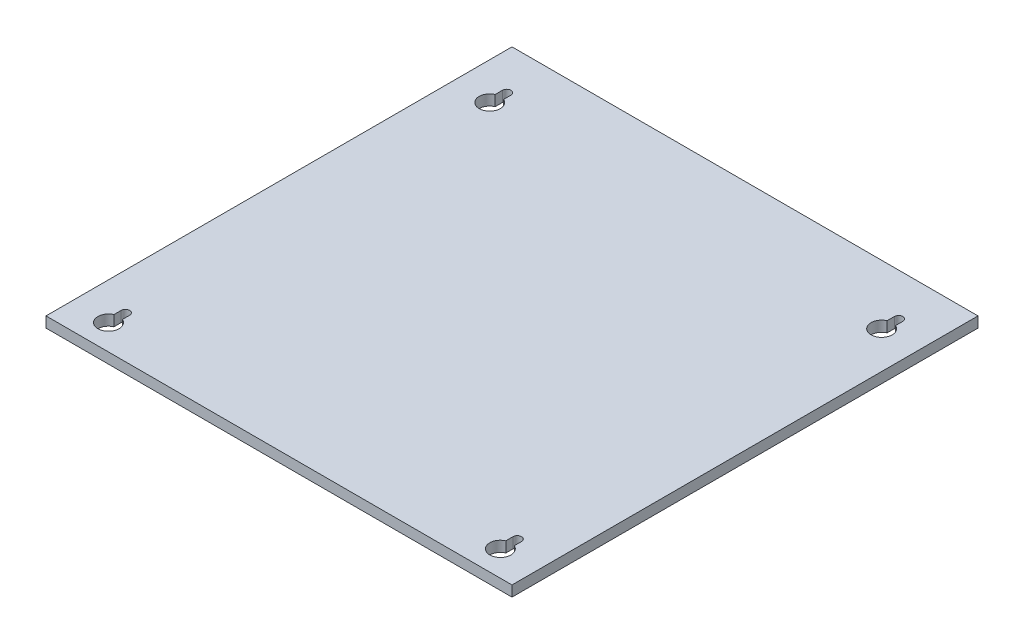
ISO-10303-21;
HEADER;
FILE_DESCRIPTION(('STEP AP214'),'2;1');
FILE_NAME('part.step','',(''),(''),'','','');
FILE_SCHEMA(('AUTOMOTIVE_DESIGN { 1 0 10303 214 1 1 1 1 }'));
ENDSEC;
DATA;
#1=APPLICATION_CONTEXT('core data for automotive mechanical design processes');
#2=APPLICATION_PROTOCOL_DEFINITION('international standard','automotive_design',2000,#1);
#3=PRODUCT_CONTEXT('',#1,'mechanical');
#4=PRODUCT('Part','Part','',(#3));
#5=PRODUCT_RELATED_PRODUCT_CATEGORY('part','',(#4));
#6=PRODUCT_DEFINITION_FORMATION('','',#4);
#7=PRODUCT_DEFINITION_CONTEXT('part definition',#1,'design');
#8=PRODUCT_DEFINITION('design','',#6,#7);
#9=PRODUCT_DEFINITION_SHAPE('','',#8);
#10=(LENGTH_UNIT() NAMED_UNIT(*) SI_UNIT(.MILLI.,.METRE.));
#11=(NAMED_UNIT(*) PLANE_ANGLE_UNIT() SI_UNIT($,.RADIAN.));
#12=(NAMED_UNIT(*) SI_UNIT($,.STERADIAN.) SOLID_ANGLE_UNIT());
#13=UNCERTAINTY_MEASURE_WITH_UNIT(LENGTH_MEASURE(1.E-05),#10,'distance_accuracy_value','');
#14=(GEOMETRIC_REPRESENTATION_CONTEXT(3) GLOBAL_UNCERTAINTY_ASSIGNED_CONTEXT((#13)) GLOBAL_UNIT_ASSIGNED_CONTEXT((#10,
#11,#12)) REPRESENTATION_CONTEXT('',''));
#15=CARTESIAN_POINT('',(0.,0.,0.));
#16=DIRECTION('',(0.,0.,1.));
#17=DIRECTION('',(1.,0.,0.));
#18=AXIS2_PLACEMENT_3D('',#15,#16,#17);
#19=CARTESIAN_POINT('',(114.935,0.,114.3));
#20=DIRECTION('',(-1.,0.,0.));
#21=DIRECTION('',(0.,0.,1.));
#22=AXIS2_PLACEMENT_3D('',#19,#20,#21);
#23=PLANE('',#22);
#24=DIRECTION('',(0.,0.,1.));
#25=VECTOR('',#24,1.);
#26=CARTESIAN_POINT('',(114.935,6.35,114.3));
#27=LINE('',#26,#25);
#28=CARTESIAN_POINT('',(114.935,6.35,114.3));
#29=VERTEX_POINT('',#28);
#30=CARTESIAN_POINT('',(114.935,6.35,118.640128867406));
#31=VERTEX_POINT('',#30);
#32=EDGE_CURVE('E314',#29,#31,#27,.T.);
#33=ORIENTED_EDGE('',*,*,#32,.T.);
#34=DIRECTION('',(0.,1.,0.));
#35=VECTOR('',#34,1.);
#36=CARTESIAN_POINT('',(114.935,0.,118.640128867406));
#37=LINE('',#36,#35);
#38=CARTESIAN_POINT('',(114.935,0.,118.640128867406));
#39=VERTEX_POINT('',#38);
#40=EDGE_CURVE('E11',#39,#31,#37,.T.);
#41=ORIENTED_EDGE('',*,*,#40,.F.);
#42=DIRECTION('',(0.,0.,1.));
#43=VECTOR('',#42,1.);
#44=CARTESIAN_POINT('',(114.935,0.,114.3));
#45=LINE('',#44,#43);
#46=CARTESIAN_POINT('',(114.935,0.,114.3));
#47=VERTEX_POINT('',#46);
#48=EDGE_CURVE('E318',#47,#39,#45,.T.);
#49=ORIENTED_EDGE('',*,*,#48,.F.);
#50=DIRECTION('',(0.,1.,0.));
#51=VECTOR('',#50,1.);
#52=CARTESIAN_POINT('',(114.935,0.,114.3));
#53=LINE('',#52,#51);
#54=EDGE_CURVE('E323',#47,#29,#53,.T.);
#55=ORIENTED_EDGE('',*,*,#54,.T.);
#56=EDGE_LOOP('',(#33,#41,#49,#55));
#57=FACE_BOUND('',#56,.T.);
#58=ADVANCED_FACE('F33',(#57),#23,.F.);
#59=CARTESIAN_POINT('',(117.475,0.,124.46));
#60=DIRECTION('',(0.,1.,0.));
#61=DIRECTION('',(0.,0.,1.));
#62=AXIS2_PLACEMENT_3D('',#59,#60,#61);
#63=CYLINDRICAL_SURFACE('',#62,6.35);
#64=CARTESIAN_POINT('',(117.475,6.35,124.46));
#65=DIRECTION('',(0.,1.,0.));
#66=DIRECTION('',(0.,0.,1.));
#67=AXIS2_PLACEMENT_3D('',#64,#65,#66);
#68=CIRCLE('',#67,6.35);
#69=CARTESIAN_POINT('',(120.015,6.35,118.640128867406));
#70=VERTEX_POINT('',#69);
#71=EDGE_CURVE('E311',#31,#70,#68,.T.);
#72=ORIENTED_EDGE('',*,*,#71,.T.);
#73=DIRECTION('',(0.,1.,0.));
#74=VECTOR('',#73,1.);
#75=CARTESIAN_POINT('',(120.015,0.,118.640128867406));
#76=LINE('',#75,#74);
#77=CARTESIAN_POINT('',(120.015,0.,118.640128867406));
#78=VERTEX_POINT('',#77);
#79=EDGE_CURVE('E40',#78,#70,#76,.T.);
#80=ORIENTED_EDGE('',*,*,#79,.F.);
#81=CARTESIAN_POINT('',(117.475,0.,124.46));
#82=DIRECTION('',(0.,1.,0.));
#83=DIRECTION('',(0.,0.,1.));
#84=AXIS2_PLACEMENT_3D('',#81,#82,#83);
#85=CIRCLE('',#84,6.35);
#86=EDGE_CURVE('E54',#39,#78,#85,.T.);
#87=ORIENTED_EDGE('',*,*,#86,.F.);
#88=ORIENTED_EDGE('',*,*,#40,.T.);
#89=EDGE_LOOP('',(#72,#80,#87,#88));
#90=FACE_BOUND('',#89,.T.);
#91=ADVANCED_FACE('F333',(#90),#63,.F.);
#92=CARTESIAN_POINT('',(120.015,0.,114.3));
#93=DIRECTION('',(1.,0.,0.));
#94=DIRECTION('',(0.,0.,-1.));
#95=AXIS2_PLACEMENT_3D('',#92,#93,#94);
#96=PLANE('',#95);
#97=DIRECTION('',(0.,0.,-1.));
#98=VECTOR('',#97,1.);
#99=CARTESIAN_POINT('',(120.015,6.35,114.3));
#100=LINE('',#99,#98);
#101=CARTESIAN_POINT('',(120.015,6.35,114.3));
#102=VERTEX_POINT('',#101);
#103=EDGE_CURVE('E308',#70,#102,#100,.T.);
#104=ORIENTED_EDGE('',*,*,#103,.T.);
#105=DIRECTION('',(0.,1.,0.));
#106=VECTOR('',#105,1.);
#107=CARTESIAN_POINT('',(120.015,0.,114.3));
#108=LINE('',#107,#106);
#109=CARTESIAN_POINT('',(120.015,0.,114.3));
#110=VERTEX_POINT('',#109);
#111=EDGE_CURVE('E326',#110,#102,#108,.T.);
#112=ORIENTED_EDGE('',*,*,#111,.F.);
#113=DIRECTION('',(0.,0.,-1.));
#114=VECTOR('',#113,1.);
#115=CARTESIAN_POINT('',(120.015,0.,114.3));
#116=LINE('',#115,#114);
#117=EDGE_CURVE('E321',#78,#110,#116,.T.);
#118=ORIENTED_EDGE('',*,*,#117,.F.);
#119=ORIENTED_EDGE('',*,*,#79,.T.);
#120=EDGE_LOOP('',(#104,#112,#118,#119));
#121=FACE_BOUND('',#120,.T.);
#122=ADVANCED_FACE('F330',(#121),#96,.F.);
#123=CARTESIAN_POINT('',(117.475,0.,114.3));
#124=DIRECTION('',(0.,1.,0.));
#125=DIRECTION('',(0.,0.,1.));
#126=AXIS2_PLACEMENT_3D('',#123,#124,#125);
#127=CYLINDRICAL_SURFACE('',#126,2.53999999999999);
#128=CARTESIAN_POINT('',(117.475,6.35,114.3));
#129=DIRECTION('',(0.,1.,0.));
#130=DIRECTION('',(0.,0.,1.));
#131=AXIS2_PLACEMENT_3D('',#128,#129,#130);
#132=CIRCLE('',#131,2.53999999999999);
#133=EDGE_CURVE('E306',#102,#29,#132,.T.);
#134=ORIENTED_EDGE('',*,*,#133,.T.);
#135=ORIENTED_EDGE('',*,*,#54,.F.);
#136=CARTESIAN_POINT('',(117.475,0.,114.3));
#137=DIRECTION('',(0.,1.,0.));
#138=DIRECTION('',(0.,0.,1.));
#139=AXIS2_PLACEMENT_3D('',#136,#137,#138);
#140=CIRCLE('',#139,2.53999999999999);
#141=EDGE_CURVE('E47',#110,#47,#140,.T.);
#142=ORIENTED_EDGE('',*,*,#141,.F.);
#143=ORIENTED_EDGE('',*,*,#111,.T.);
#144=EDGE_LOOP('',(#134,#135,#142,#143));
#145=FACE_BOUND('',#144,.T.);
#146=ADVANCED_FACE('F339',(#145),#127,.F.);
#147=CARTESIAN_POINT('',(-120.015,0.,114.3));
#148=DIRECTION('',(-1.,0.,0.));
#149=DIRECTION('',(0.,0.,1.));
#150=AXIS2_PLACEMENT_3D('',#147,#148,#149);
#151=PLANE('',#150);
#152=DIRECTION('',(0.,0.,1.));
#153=VECTOR('',#152,1.);
#154=CARTESIAN_POINT('',(-120.015,6.35,114.3));
#155=LINE('',#154,#153);
#156=CARTESIAN_POINT('',(-120.015,6.35,114.3));
#157=VERTEX_POINT('',#156);
#158=CARTESIAN_POINT('',(-120.015,6.35,118.640128867406));
#159=VERTEX_POINT('',#158);
#160=EDGE_CURVE('E282',#157,#159,#155,.T.);
#161=ORIENTED_EDGE('',*,*,#160,.T.);
#162=DIRECTION('',(0.,1.,0.));
#163=VECTOR('',#162,1.);
#164=CARTESIAN_POINT('',(-120.015,0.,118.640128867406));
#165=LINE('',#164,#163);
#166=CARTESIAN_POINT('',(-120.015,0.,118.640128867406));
#167=VERTEX_POINT('',#166);
#168=EDGE_CURVE('E303',#167,#159,#165,.T.);
#169=ORIENTED_EDGE('',*,*,#168,.F.);
#170=DIRECTION('',(0.,0.,1.));
#171=VECTOR('',#170,1.);
#172=CARTESIAN_POINT('',(-120.015,0.,114.3));
#173=LINE('',#172,#171);
#174=CARTESIAN_POINT('',(-120.015,0.,114.3));
#175=VERTEX_POINT('',#174);
#176=EDGE_CURVE('E287',#175,#167,#173,.T.);
#177=ORIENTED_EDGE('',*,*,#176,.F.);
#178=DIRECTION('',(0.,1.,0.));
#179=VECTOR('',#178,1.);
#180=CARTESIAN_POINT('',(-120.015,0.,114.3));
#181=LINE('',#180,#179);
#182=EDGE_CURVE('E294',#175,#157,#181,.T.);
#183=ORIENTED_EDGE('',*,*,#182,.T.);
#184=EDGE_LOOP('',(#161,#169,#177,#183));
#185=FACE_BOUND('',#184,.T.);
#186=ADVANCED_FACE('F341',(#185),#151,.F.);
#187=CARTESIAN_POINT('',(-117.475,0.,124.46));
#188=DIRECTION('',(0.,1.,0.));
#189=DIRECTION('',(0.,0.,1.));
#190=AXIS2_PLACEMENT_3D('',#187,#188,#189);
#191=CYLINDRICAL_SURFACE('',#190,6.35);
#192=CARTESIAN_POINT('',(-117.475,6.35,124.46));
#193=DIRECTION('',(0.,1.,0.));
#194=DIRECTION('',(0.,0.,1.));
#195=AXIS2_PLACEMENT_3D('',#192,#193,#194);
#196=CIRCLE('',#195,6.35);
#197=CARTESIAN_POINT('',(-114.935,6.35,118.640128867406));
#198=VERTEX_POINT('',#197);
#199=EDGE_CURVE('E279',#159,#198,#196,.T.);
#200=ORIENTED_EDGE('',*,*,#199,.T.);
#201=DIRECTION('',(0.,1.,0.));
#202=VECTOR('',#201,1.);
#203=CARTESIAN_POINT('',(-114.935,0.,118.640128867406));
#204=LINE('',#203,#202);
#205=CARTESIAN_POINT('',(-114.935,0.,118.640128867406));
#206=VERTEX_POINT('',#205);
#207=EDGE_CURVE('E300',#206,#198,#204,.T.);
#208=ORIENTED_EDGE('',*,*,#207,.F.);
#209=CARTESIAN_POINT('',(-117.475,0.,124.46));
#210=DIRECTION('',(0.,1.,0.));
#211=DIRECTION('',(0.,0.,1.));
#212=AXIS2_PLACEMENT_3D('',#209,#210,#211);
#213=CIRCLE('',#212,6.35);
#214=EDGE_CURVE('E289',#167,#206,#213,.T.);
#215=ORIENTED_EDGE('',*,*,#214,.F.);
#216=ORIENTED_EDGE('',*,*,#168,.T.);
#217=EDGE_LOOP('',(#200,#208,#215,#216));
#218=FACE_BOUND('',#217,.T.);
#219=ADVANCED_FACE('F347',(#218),#191,.F.);
#220=CARTESIAN_POINT('',(-114.935,0.,114.3));
#221=DIRECTION('',(1.,0.,0.));
#222=DIRECTION('',(0.,0.,-1.));
#223=AXIS2_PLACEMENT_3D('',#220,#221,#222);
#224=PLANE('',#223);
#225=DIRECTION('',(0.,0.,-1.));
#226=VECTOR('',#225,1.);
#227=CARTESIAN_POINT('',(-114.935,6.35,114.3));
#228=LINE('',#227,#226);
#229=CARTESIAN_POINT('',(-114.935,6.35,114.3));
#230=VERTEX_POINT('',#229);
#231=EDGE_CURVE('E276',#198,#230,#228,.T.);
#232=ORIENTED_EDGE('',*,*,#231,.T.);
#233=DIRECTION('',(0.,1.,0.));
#234=VECTOR('',#233,1.);
#235=CARTESIAN_POINT('',(-114.935,0.,114.3));
#236=LINE('',#235,#234);
#237=CARTESIAN_POINT('',(-114.935,0.,114.3));
#238=VERTEX_POINT('',#237);
#239=EDGE_CURVE('E297',#238,#230,#236,.T.);
#240=ORIENTED_EDGE('',*,*,#239,.F.);
#241=DIRECTION('',(0.,0.,-1.));
#242=VECTOR('',#241,1.);
#243=CARTESIAN_POINT('',(-114.935,0.,114.3));
#244=LINE('',#243,#242);
#245=EDGE_CURVE('E291',#206,#238,#244,.T.);
#246=ORIENTED_EDGE('',*,*,#245,.F.);
#247=ORIENTED_EDGE('',*,*,#207,.T.);
#248=EDGE_LOOP('',(#232,#240,#246,#247));
#249=FACE_BOUND('',#248,.T.);
#250=ADVANCED_FACE('F380',(#249),#224,.F.);
#251=CARTESIAN_POINT('',(-117.475,0.,114.3));
#252=DIRECTION('',(0.,1.,0.));
#253=DIRECTION('',(0.,0.,1.));
#254=AXIS2_PLACEMENT_3D('',#251,#252,#253);
#255=CYLINDRICAL_SURFACE('',#254,2.53999999999999);
#256=CARTESIAN_POINT('',(-117.475,6.35,114.3));
#257=DIRECTION('',(0.,1.,0.));
#258=DIRECTION('',(0.,0.,1.));
#259=AXIS2_PLACEMENT_3D('',#256,#257,#258);
#260=CIRCLE('',#259,2.53999999999999);
#261=EDGE_CURVE('E274',#230,#157,#260,.T.);
#262=ORIENTED_EDGE('',*,*,#261,.T.);
#263=ORIENTED_EDGE('',*,*,#182,.F.);
#264=CARTESIAN_POINT('',(-117.475,0.,114.3));
#265=DIRECTION('',(0.,1.,0.));
#266=DIRECTION('',(0.,0.,1.));
#267=AXIS2_PLACEMENT_3D('',#264,#265,#266);
#268=CIRCLE('',#267,2.53999999999999);
#269=EDGE_CURVE('E285',#238,#175,#268,.T.);
#270=ORIENTED_EDGE('',*,*,#269,.F.);
#271=ORIENTED_EDGE('',*,*,#239,.T.);
#272=EDGE_LOOP('',(#262,#263,#270,#271));
#273=FACE_BOUND('',#272,.T.);
#274=ADVANCED_FACE('F390',(#273),#255,.F.);
#275=CARTESIAN_POINT('',(139.7,6.35,139.7));
#276=DIRECTION('',(-1.,0.,0.));
#277=DIRECTION('',(0.,0.,1.));
#278=AXIS2_PLACEMENT_3D('',#275,#276,#277);
#279=PLANE('',#278);
#280=DIRECTION('',(0.,0.,-1.));
#281=VECTOR('',#280,1.);
#282=CARTESIAN_POINT('',(139.7,0.,139.7));
#283=LINE('',#282,#281);
#284=CARTESIAN_POINT('',(139.7,0.,139.7));
#285=VERTEX_POINT('',#284);
#286=CARTESIAN_POINT('',(139.7,0.,-139.7));
#287=VERTEX_POINT('',#286);
#288=EDGE_CURVE('E238',#285,#287,#283,.T.);
#289=ORIENTED_EDGE('',*,*,#288,.T.);
#290=DIRECTION('',(0.,-1.,0.));
#291=VECTOR('',#290,1.);
#292=CARTESIAN_POINT('',(139.7,6.35,-139.7));
#293=LINE('',#292,#291);
#294=CARTESIAN_POINT('',(139.7,6.35,-139.7));
#295=VERTEX_POINT('',#294);
#296=EDGE_CURVE('E271',#295,#287,#293,.T.);
#297=ORIENTED_EDGE('',*,*,#296,.F.);
#298=DIRECTION('',(0.,0.,-1.));
#299=VECTOR('',#298,1.);
#300=CARTESIAN_POINT('',(139.7,6.35,139.7));
#301=LINE('',#300,#299);
#302=CARTESIAN_POINT('',(139.7,6.35,139.7));
#303=VERTEX_POINT('',#302);
#304=EDGE_CURVE('E245',#303,#295,#301,.T.);
#305=ORIENTED_EDGE('',*,*,#304,.F.);
#306=DIRECTION('',(0.,-1.,0.));
#307=VECTOR('',#306,1.);
#308=CARTESIAN_POINT('',(139.7,6.35,139.7));
#309=LINE('',#308,#307);
#310=EDGE_CURVE('E255',#303,#285,#309,.T.);
#311=ORIENTED_EDGE('',*,*,#310,.T.);
#312=EDGE_LOOP('',(#289,#297,#305,#311));
#313=FACE_BOUND('',#312,.T.);
#314=ADVANCED_FACE('F400',(#313),#279,.F.);
#315=CARTESIAN_POINT('',(-139.7,6.35,-139.7));
#316=DIRECTION('',(0.,0.,1.));
#317=DIRECTION('',(1.,0.,0.));
#318=AXIS2_PLACEMENT_3D('',#315,#316,#317);
#319=PLANE('',#318);
#320=DIRECTION('',(-1.,0.,0.));
#321=VECTOR('',#320,1.);
#322=CARTESIAN_POINT('',(-139.7,0.,-139.7));
#323=LINE('',#322,#321);
#324=CARTESIAN_POINT('',(-139.7,0.,-139.7));
#325=VERTEX_POINT('',#324);
#326=EDGE_CURVE('E258',#287,#325,#323,.T.);
#327=ORIENTED_EDGE('',*,*,#326,.T.);
#328=DIRECTION('',(0.,-1.,0.));
#329=VECTOR('',#328,1.);
#330=CARTESIAN_POINT('',(-139.7,6.35,-139.7));
#331=LINE('',#330,#329);
#332=CARTESIAN_POINT('',(-139.7,6.35,-139.7));
#333=VERTEX_POINT('',#332);
#334=EDGE_CURVE('E268',#333,#325,#331,.T.);
#335=ORIENTED_EDGE('',*,*,#334,.F.);
#336=DIRECTION('',(-1.,0.,0.));
#337=VECTOR('',#336,1.);
#338=CARTESIAN_POINT('',(-139.7,6.35,-139.7));
#339=LINE('',#338,#337);
#340=EDGE_CURVE('E248',#295,#333,#339,.T.);
#341=ORIENTED_EDGE('',*,*,#340,.F.);
#342=ORIENTED_EDGE('',*,*,#296,.T.);
#343=EDGE_LOOP('',(#327,#335,#341,#342));
#344=FACE_BOUND('',#343,.T.);
#345=ADVANCED_FACE('F486',(#344),#319,.F.);
#346=CARTESIAN_POINT('',(-139.7,6.35,139.7));
#347=DIRECTION('',(1.,0.,0.));
#348=DIRECTION('',(0.,0.,-1.));
#349=AXIS2_PLACEMENT_3D('',#346,#347,#348);
#350=PLANE('',#349);
#351=DIRECTION('',(0.,0.,1.));
#352=VECTOR('',#351,1.);
#353=CARTESIAN_POINT('',(-139.7,0.,139.7));
#354=LINE('',#353,#352);
#355=CARTESIAN_POINT('',(-139.7,0.,139.7));
#356=VERTEX_POINT('',#355);
#357=EDGE_CURVE('E260',#325,#356,#354,.T.);
#358=ORIENTED_EDGE('',*,*,#357,.T.);
#359=DIRECTION('',(0.,-1.,0.));
#360=VECTOR('',#359,1.);
#361=CARTESIAN_POINT('',(-139.7,6.35,139.7));
#362=LINE('',#361,#360);
#363=CARTESIAN_POINT('',(-139.7,6.35,139.7));
#364=VERTEX_POINT('',#363);
#365=EDGE_CURVE('E265',#364,#356,#362,.T.);
#366=ORIENTED_EDGE('',*,*,#365,.F.);
#367=DIRECTION('',(0.,0.,1.));
#368=VECTOR('',#367,1.);
#369=CARTESIAN_POINT('',(-139.7,6.35,139.7));
#370=LINE('',#369,#368);
#371=EDGE_CURVE('E251',#333,#364,#370,.T.);
#372=ORIENTED_EDGE('',*,*,#371,.F.);
#373=ORIENTED_EDGE('',*,*,#334,.T.);
#374=EDGE_LOOP('',(#358,#366,#372,#373));
#375=FACE_BOUND('',#374,.T.);
#376=ADVANCED_FACE('F482',(#375),#350,.F.);
#377=CARTESIAN_POINT('',(-139.7,6.35,139.7));
#378=DIRECTION('',(0.,0.,-1.));
#379=DIRECTION('',(-1.,0.,0.));
#380=AXIS2_PLACEMENT_3D('',#377,#378,#379);
#381=PLANE('',#380);
#382=DIRECTION('',(1.,0.,0.));
#383=VECTOR('',#382,1.);
#384=CARTESIAN_POINT('',(-139.7,0.,139.7));
#385=LINE('',#384,#383);
#386=EDGE_CURVE('E249',#356,#285,#385,.T.);
#387=ORIENTED_EDGE('',*,*,#386,.T.);
#388=ORIENTED_EDGE('',*,*,#310,.F.);
#389=DIRECTION('',(1.,0.,0.));
#390=VECTOR('',#389,1.);
#391=CARTESIAN_POINT('',(-139.7,6.35,139.7));
#392=LINE('',#391,#390);
#393=EDGE_CURVE('E253',#364,#303,#392,.T.);
#394=ORIENTED_EDGE('',*,*,#393,.F.);
#395=ORIENTED_EDGE('',*,*,#365,.T.);
#396=EDGE_LOOP('',(#387,#388,#394,#395));
#397=FACE_BOUND('',#396,.T.);
#398=ADVANCED_FACE('F413',(#397),#381,.F.);
#399=CARTESIAN_POINT('',(0.,6.35,0.));
#400=DIRECTION('',(0.,-1.,0.));
#401=DIRECTION('',(0.,0.,-1.));
#402=AXIS2_PLACEMENT_3D('',#399,#400,#401);
#403=PLANE('',#402);
#404=DIRECTION('',(0.,0.,1.));
#405=VECTOR('',#404,1.);
#406=CARTESIAN_POINT('',(114.935,6.35,-114.3));
#407=LINE('',#406,#405);
#408=CARTESIAN_POINT('',(114.935,6.35,-114.3));
#409=VERTEX_POINT('',#408);
#410=CARTESIAN_POINT('',(114.935,6.35,-109.959871132594));
#411=VERTEX_POINT('',#410);
#412=EDGE_CURVE('E171',#409,#411,#407,.T.);
#413=ORIENTED_EDGE('',*,*,#412,.F.);
#414=CARTESIAN_POINT('',(117.475,6.35,-114.3));
#415=DIRECTION('',(0.,1.,0.));
#416=DIRECTION('',(0.,0.,1.));
#417=AXIS2_PLACEMENT_3D('',#414,#415,#416);
#418=CIRCLE('',#417,2.53999999999999);
#419=CARTESIAN_POINT('',(120.015,6.35,-114.3));
#420=VERTEX_POINT('',#419);
#421=EDGE_CURVE('E207',#420,#409,#418,.T.);
#422=ORIENTED_EDGE('',*,*,#421,.F.);
#423=DIRECTION('',(0.,0.,-1.));
#424=VECTOR('',#423,1.);
#425=CARTESIAN_POINT('',(120.015,6.35,-114.3));
#426=LINE('',#425,#424);
#427=CARTESIAN_POINT('',(120.015,6.35,-109.959871132594));
#428=VERTEX_POINT('',#427);
#429=EDGE_CURVE('E193',#428,#420,#426,.T.);
#430=ORIENTED_EDGE('',*,*,#429,.F.);
#431=CARTESIAN_POINT('',(117.475,6.35,-104.14));
#432=DIRECTION('',(0.,1.,0.));
#433=DIRECTION('',(0.,0.,1.));
#434=AXIS2_PLACEMENT_3D('',#431,#432,#433);
#435=CIRCLE('',#434,6.35);
#436=EDGE_CURVE('E185',#411,#428,#435,.T.);
#437=ORIENTED_EDGE('',*,*,#436,.F.);
#438=EDGE_LOOP('',(#413,#422,#430,#437));
#439=FACE_BOUND('',#438,.T.);
#440=DIRECTION('',(0.,0.,1.));
#441=VECTOR('',#440,1.);
#442=CARTESIAN_POINT('',(-120.015,6.35,-114.3));
#443=LINE('',#442,#441);
#444=CARTESIAN_POINT('',(-120.015,6.35,-114.3));
#445=VERTEX_POINT('',#444);
#446=CARTESIAN_POINT('',(-120.015,6.35,-109.959871132594));
#447=VERTEX_POINT('',#446);
#448=EDGE_CURVE('E228',#445,#447,#443,.T.);
#449=ORIENTED_EDGE('',*,*,#448,.F.);
#450=CARTESIAN_POINT('',(-117.475,6.35,-114.3));
#451=DIRECTION('',(0.,1.,0.));
#452=DIRECTION('',(0.,0.,1.));
#453=AXIS2_PLACEMENT_3D('',#450,#451,#452);
#454=CIRCLE('',#453,2.53999999999999);
#455=CARTESIAN_POINT('',(-114.935,6.35,-114.3));
#456=VERTEX_POINT('',#455);
#457=EDGE_CURVE('E212',#456,#445,#454,.T.);
#458=ORIENTED_EDGE('',*,*,#457,.F.);
#459=DIRECTION('',(0.,0.,-1.));
#460=VECTOR('',#459,1.);
#461=CARTESIAN_POINT('',(-114.935,6.35,-114.3));
#462=LINE('',#461,#460);
#463=CARTESIAN_POINT('',(-114.935,6.35,-109.959871132594));
#464=VERTEX_POINT('',#463);
#465=EDGE_CURVE('E217',#464,#456,#462,.T.);
#466=ORIENTED_EDGE('',*,*,#465,.F.);
#467=CARTESIAN_POINT('',(-117.475,6.35,-104.14));
#468=DIRECTION('',(0.,1.,0.));
#469=DIRECTION('',(0.,0.,1.));
#470=AXIS2_PLACEMENT_3D('',#467,#468,#469);
#471=CIRCLE('',#470,6.35);
#472=EDGE_CURVE('E231',#447,#464,#471,.T.);
#473=ORIENTED_EDGE('',*,*,#472,.F.);
#474=EDGE_LOOP('',(#449,#458,#466,#473));
#475=FACE_BOUND('',#474,.T.);
#476=ORIENTED_EDGE('',*,*,#304,.T.);
#477=ORIENTED_EDGE('',*,*,#340,.T.);
#478=ORIENTED_EDGE('',*,*,#371,.T.);
#479=ORIENTED_EDGE('',*,*,#393,.T.);
#480=EDGE_LOOP('',(#476,#477,#478,#479));
#481=FACE_BOUND('',#480,.T.);
#482=ORIENTED_EDGE('',*,*,#261,.F.);
#483=ORIENTED_EDGE('',*,*,#231,.F.);
#484=ORIENTED_EDGE('',*,*,#199,.F.);
#485=ORIENTED_EDGE('',*,*,#160,.F.);
#486=EDGE_LOOP('',(#482,#483,#484,#485));
#487=FACE_BOUND('',#486,.T.);
#488=ORIENTED_EDGE('',*,*,#133,.F.);
#489=ORIENTED_EDGE('',*,*,#103,.F.);
#490=ORIENTED_EDGE('',*,*,#71,.F.);
#491=ORIENTED_EDGE('',*,*,#32,.F.);
#492=EDGE_LOOP('',(#488,#489,#490,#491));
#493=FACE_BOUND('',#492,.T.);
#494=ADVANCED_FACE('F191',(#439,#475,#481,#487,#493),#403,.F.);
#495=CARTESIAN_POINT('',(0.,0.,0.));
#496=DIRECTION('',(0.,-1.,0.));
#497=DIRECTION('',(0.,0.,-1.));
#498=AXIS2_PLACEMENT_3D('',#495,#496,#497);
#499=PLANE('',#498);
#500=CARTESIAN_POINT('',(117.475,0.,-114.3));
#501=DIRECTION('',(0.,1.,0.));
#502=DIRECTION('',(0.,0.,1.));
#503=AXIS2_PLACEMENT_3D('',#500,#501,#502);
#504=CIRCLE('',#503,2.53999999999999);
#505=CARTESIAN_POINT('',(120.015,0.,-114.3));
#506=VERTEX_POINT('',#505);
#507=CARTESIAN_POINT('',(114.935,0.,-114.3));
#508=VERTEX_POINT('',#507);
#509=EDGE_CURVE('E209',#506,#508,#504,.T.);
#510=ORIENTED_EDGE('',*,*,#509,.T.);
#511=DIRECTION('',(0.,0.,1.));
#512=VECTOR('',#511,1.);
#513=CARTESIAN_POINT('',(114.935,0.,-114.3));
#514=LINE('',#513,#512);
#515=CARTESIAN_POINT('',(114.935,0.,-109.959871132594));
#516=VERTEX_POINT('',#515);
#517=EDGE_CURVE('E181',#508,#516,#514,.T.);
#518=ORIENTED_EDGE('',*,*,#517,.T.);
#519=CARTESIAN_POINT('',(117.475,0.,-104.14));
#520=DIRECTION('',(0.,1.,0.));
#521=DIRECTION('',(0.,0.,1.));
#522=AXIS2_PLACEMENT_3D('',#519,#520,#521);
#523=CIRCLE('',#522,6.35);
#524=CARTESIAN_POINT('',(120.015,0.,-109.959871132594));
#525=VERTEX_POINT('',#524);
#526=EDGE_CURVE('E188',#516,#525,#523,.T.);
#527=ORIENTED_EDGE('',*,*,#526,.T.);
#528=DIRECTION('',(0.,0.,-1.));
#529=VECTOR('',#528,1.);
#530=CARTESIAN_POINT('',(120.015,0.,-114.3));
#531=LINE('',#530,#529);
#532=EDGE_CURVE('E204',#525,#506,#531,.T.);
#533=ORIENTED_EDGE('',*,*,#532,.T.);
#534=EDGE_LOOP('',(#510,#518,#527,#533));
#535=FACE_BOUND('',#534,.T.);
#536=CARTESIAN_POINT('',(-117.475,0.,-114.3));
#537=DIRECTION('',(0.,1.,0.));
#538=DIRECTION('',(0.,0.,1.));
#539=AXIS2_PLACEMENT_3D('',#536,#537,#538);
#540=CIRCLE('',#539,2.53999999999999);
#541=CARTESIAN_POINT('',(-114.935,0.,-114.3));
#542=VERTEX_POINT('',#541);
#543=CARTESIAN_POINT('',(-120.015,0.,-114.3));
#544=VERTEX_POINT('',#543);
#545=EDGE_CURVE('E213',#542,#544,#540,.T.);
#546=ORIENTED_EDGE('',*,*,#545,.T.);
#547=DIRECTION('',(0.,0.,1.));
#548=VECTOR('',#547,1.);
#549=CARTESIAN_POINT('',(-120.015,0.,-114.3));
#550=LINE('',#549,#548);
#551=CARTESIAN_POINT('',(-120.015,0.,-109.959871132594));
#552=VERTEX_POINT('',#551);
#553=EDGE_CURVE('E216',#544,#552,#550,.T.);
#554=ORIENTED_EDGE('',*,*,#553,.T.);
#555=CARTESIAN_POINT('',(-117.475,0.,-104.14));
#556=DIRECTION('',(0.,1.,0.));
#557=DIRECTION('',(0.,0.,1.));
#558=AXIS2_PLACEMENT_3D('',#555,#556,#557);
#559=CIRCLE('',#558,6.35);
#560=CARTESIAN_POINT('',(-114.935,0.,-109.959871132594));
#561=VERTEX_POINT('',#560);
#562=EDGE_CURVE('E220',#552,#561,#559,.T.);
#563=ORIENTED_EDGE('',*,*,#562,.T.);
#564=DIRECTION('',(0.,0.,-1.));
#565=VECTOR('',#564,1.);
#566=CARTESIAN_POINT('',(-114.935,0.,-114.3));
#567=LINE('',#566,#565);
#568=EDGE_CURVE('E223',#561,#542,#567,.T.);
#569=ORIENTED_EDGE('',*,*,#568,.T.);
#570=EDGE_LOOP('',(#546,#554,#563,#569));
#571=FACE_BOUND('',#570,.T.);
#572=ORIENTED_EDGE('',*,*,#288,.F.);
#573=ORIENTED_EDGE('',*,*,#386,.F.);
#574=ORIENTED_EDGE('',*,*,#357,.F.);
#575=ORIENTED_EDGE('',*,*,#326,.F.);
#576=EDGE_LOOP('',(#572,#573,#574,#575));
#577=FACE_BOUND('',#576,.T.);
#578=ORIENTED_EDGE('',*,*,#269,.T.);
#579=ORIENTED_EDGE('',*,*,#176,.T.);
#580=ORIENTED_EDGE('',*,*,#214,.T.);
#581=ORIENTED_EDGE('',*,*,#245,.T.);
#582=EDGE_LOOP('',(#578,#579,#580,#581));
#583=FACE_BOUND('',#582,.T.);
#584=ORIENTED_EDGE('',*,*,#141,.T.);
#585=ORIENTED_EDGE('',*,*,#48,.T.);
#586=ORIENTED_EDGE('',*,*,#86,.T.);
#587=ORIENTED_EDGE('',*,*,#117,.T.);
#588=EDGE_LOOP('',(#584,#585,#586,#587));
#589=FACE_BOUND('',#588,.T.);
#590=ADVANCED_FACE('F412',(#535,#571,#577,#583,#589),#499,.T.);
#591=CARTESIAN_POINT('',(-117.475,0.,-114.3));
#592=DIRECTION('',(0.,1.,0.));
#593=DIRECTION('',(0.,0.,1.));
#594=AXIS2_PLACEMENT_3D('',#591,#592,#593);
#595=CYLINDRICAL_SURFACE('',#594,2.53999999999999);
#596=ORIENTED_EDGE('',*,*,#457,.T.);
#597=DIRECTION('',(0.,1.,0.));
#598=VECTOR('',#597,1.);
#599=CARTESIAN_POINT('',(-120.015,0.,-114.3));
#600=LINE('',#599,#598);
#601=EDGE_CURVE('E226',#544,#445,#600,.T.);
#602=ORIENTED_EDGE('',*,*,#601,.F.);
#603=ORIENTED_EDGE('',*,*,#545,.F.);
#604=DIRECTION('',(0.,1.,0.));
#605=VECTOR('',#604,1.);
#606=CARTESIAN_POINT('',(-114.935,0.,-114.3));
#607=LINE('',#606,#605);
#608=EDGE_CURVE('E236',#542,#456,#607,.T.);
#609=ORIENTED_EDGE('',*,*,#608,.T.);
#610=EDGE_LOOP('',(#596,#602,#603,#609));
#611=FACE_BOUND('',#610,.T.);
#612=ADVANCED_FACE('F424',(#611),#595,.F.);
#613=CARTESIAN_POINT('',(-114.935,0.,-114.3));
#614=DIRECTION('',(1.,0.,0.));
#615=DIRECTION('',(0.,0.,-1.));
#616=AXIS2_PLACEMENT_3D('',#613,#614,#615);
#617=PLANE('',#616);
#618=ORIENTED_EDGE('',*,*,#465,.T.);
#619=ORIENTED_EDGE('',*,*,#608,.F.);
#620=ORIENTED_EDGE('',*,*,#568,.F.);
#621=DIRECTION('',(0.,1.,0.));
#622=VECTOR('',#621,1.);
#623=CARTESIAN_POINT('',(-114.935,0.,-109.959871132594));
#624=LINE('',#623,#622);
#625=EDGE_CURVE('E239',#561,#464,#624,.T.);
#626=ORIENTED_EDGE('',*,*,#625,.T.);
#627=EDGE_LOOP('',(#618,#619,#620,#626));
#628=FACE_BOUND('',#627,.T.);
#629=ADVANCED_FACE('F469',(#628),#617,.F.);
#630=CARTESIAN_POINT('',(-117.475,0.,-104.14));
#631=DIRECTION('',(0.,1.,0.));
#632=DIRECTION('',(0.,0.,1.));
#633=AXIS2_PLACEMENT_3D('',#630,#631,#632);
#634=CYLINDRICAL_SURFACE('',#633,6.35);
#635=ORIENTED_EDGE('',*,*,#472,.T.);
#636=ORIENTED_EDGE('',*,*,#625,.F.);
#637=ORIENTED_EDGE('',*,*,#562,.F.);
#638=DIRECTION('',(0.,1.,0.));
#639=VECTOR('',#638,1.);
#640=CARTESIAN_POINT('',(-120.015,0.,-109.959871132594));
#641=LINE('',#640,#639);
#642=EDGE_CURVE('E241',#552,#447,#641,.T.);
#643=ORIENTED_EDGE('',*,*,#642,.T.);
#644=EDGE_LOOP('',(#635,#636,#637,#643));
#645=FACE_BOUND('',#644,.T.);
#646=ADVANCED_FACE('F472',(#645),#634,.F.);
#647=CARTESIAN_POINT('',(-120.015,0.,-114.3));
#648=DIRECTION('',(-1.,0.,0.));
#649=DIRECTION('',(0.,0.,1.));
#650=AXIS2_PLACEMENT_3D('',#647,#648,#649);
#651=PLANE('',#650);
#652=ORIENTED_EDGE('',*,*,#448,.T.);
#653=ORIENTED_EDGE('',*,*,#642,.F.);
#654=ORIENTED_EDGE('',*,*,#553,.F.);
#655=ORIENTED_EDGE('',*,*,#601,.T.);
#656=EDGE_LOOP('',(#652,#653,#654,#655));
#657=FACE_BOUND('',#656,.T.);
#658=ADVANCED_FACE('F437',(#657),#651,.F.);
#659=CARTESIAN_POINT('',(117.475,0.,-114.3));
#660=DIRECTION('',(0.,1.,0.));
#661=DIRECTION('',(0.,0.,1.));
#662=AXIS2_PLACEMENT_3D('',#659,#660,#661);
#663=CYLINDRICAL_SURFACE('',#662,2.53999999999999);
#664=ORIENTED_EDGE('',*,*,#421,.T.);
#665=DIRECTION('',(0.,1.,0.));
#666=VECTOR('',#665,1.);
#667=CARTESIAN_POINT('',(114.935,0.,-114.3));
#668=LINE('',#667,#666);
#669=EDGE_CURVE('E177',#508,#409,#668,.T.);
#670=ORIENTED_EDGE('',*,*,#669,.F.);
#671=ORIENTED_EDGE('',*,*,#509,.F.);
#672=DIRECTION('',(0.,1.,0.));
#673=VECTOR('',#672,1.);
#674=CARTESIAN_POINT('',(120.015,0.,-114.3));
#675=LINE('',#674,#673);
#676=EDGE_CURVE('E201',#506,#420,#675,.T.);
#677=ORIENTED_EDGE('',*,*,#676,.T.);
#678=EDGE_LOOP('',(#664,#670,#671,#677));
#679=FACE_BOUND('',#678,.T.);
#680=ADVANCED_FACE('F432',(#679),#663,.F.);
#681=CARTESIAN_POINT('',(120.015,0.,-114.3));
#682=DIRECTION('',(1.,0.,0.));
#683=DIRECTION('',(0.,0.,-1.));
#684=AXIS2_PLACEMENT_3D('',#681,#682,#683);
#685=PLANE('',#684);
#686=ORIENTED_EDGE('',*,*,#429,.T.);
#687=ORIENTED_EDGE('',*,*,#676,.F.);
#688=ORIENTED_EDGE('',*,*,#532,.F.);
#689=DIRECTION('',(0.,1.,0.));
#690=VECTOR('',#689,1.);
#691=CARTESIAN_POINT('',(120.015,0.,-109.959871132594));
#692=LINE('',#691,#690);
#693=EDGE_CURVE('E194',#525,#428,#692,.T.);
#694=ORIENTED_EDGE('',*,*,#693,.T.);
#695=EDGE_LOOP('',(#686,#687,#688,#694));
#696=FACE_BOUND('',#695,.T.);
#697=ADVANCED_FACE('F436',(#696),#685,.F.);
#698=CARTESIAN_POINT('',(117.475,0.,-104.14));
#699=DIRECTION('',(0.,1.,0.));
#700=DIRECTION('',(0.,0.,1.));
#701=AXIS2_PLACEMENT_3D('',#698,#699,#700);
#702=CYLINDRICAL_SURFACE('',#701,6.35);
#703=ORIENTED_EDGE('',*,*,#436,.T.);
#704=ORIENTED_EDGE('',*,*,#693,.F.);
#705=ORIENTED_EDGE('',*,*,#526,.F.);
#706=DIRECTION('',(0.,1.,0.));
#707=VECTOR('',#706,1.);
#708=CARTESIAN_POINT('',(114.935,0.,-109.959871132594));
#709=LINE('',#708,#707);
#710=EDGE_CURVE('E174',#516,#411,#709,.T.);
#711=ORIENTED_EDGE('',*,*,#710,.T.);
#712=EDGE_LOOP('',(#703,#704,#705,#711));
#713=FACE_BOUND('',#712,.T.);
#714=ADVANCED_FACE('F184',(#713),#702,.F.);
#715=CARTESIAN_POINT('',(114.935,0.,-114.3));
#716=DIRECTION('',(-1.,0.,0.));
#717=DIRECTION('',(0.,0.,1.));
#718=AXIS2_PLACEMENT_3D('',#715,#716,#717);
#719=PLANE('',#718);
#720=ORIENTED_EDGE('',*,*,#412,.T.);
#721=ORIENTED_EDGE('',*,*,#710,.F.);
#722=ORIENTED_EDGE('',*,*,#517,.F.);
#723=ORIENTED_EDGE('',*,*,#669,.T.);
#724=EDGE_LOOP('',(#720,#721,#722,#723));
#725=FACE_BOUND('',#724,.T.);
#726=ADVANCED_FACE('F173',(#725),#719,.F.);
#727=CLOSED_SHELL('',(#58,#91,#122,#146,#186,#219,#250,#274,#314,#345,#376,#398,#494,#590,#612,
#629,#646,#658,#680,#697,#714,#726));
#728=MANIFOLD_SOLID_BREP('B2',#727);
#729=ADVANCED_BREP_SHAPE_REPRESENTATION('',(#18,#728),#14);
#730=SHAPE_DEFINITION_REPRESENTATION(#9,#729);
ENDSEC;
END-ISO-10303-21;
